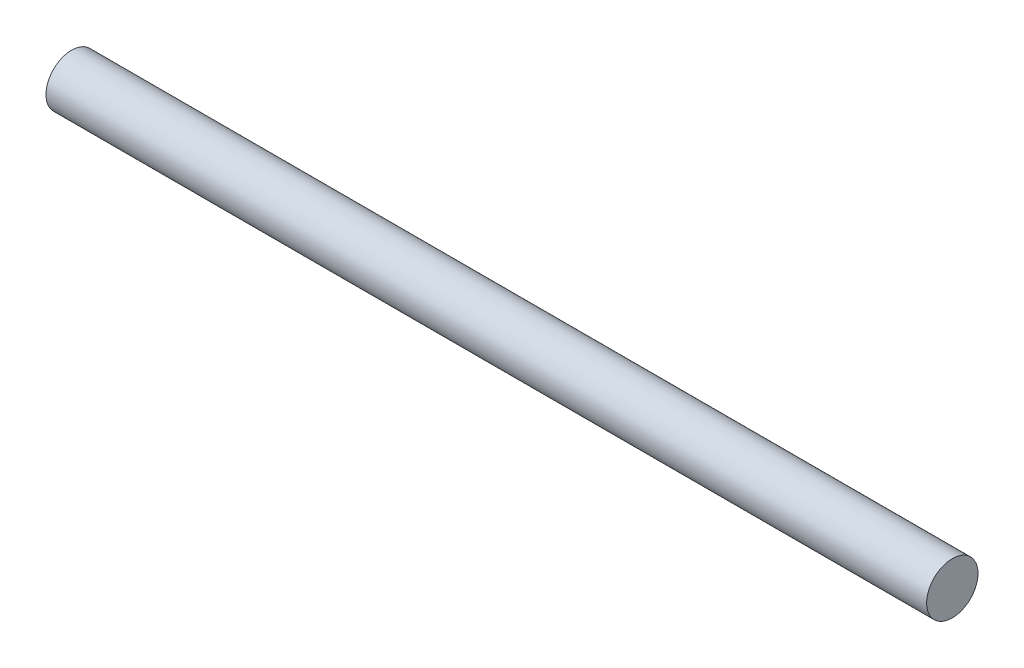
ISO-10303-21;
HEADER;
FILE_DESCRIPTION(('STEP AP214'),'2;1');
FILE_NAME('part.step','',(''),(''),'','','');
FILE_SCHEMA(('AUTOMOTIVE_DESIGN { 1 0 10303 214 1 1 1 1 }'));
ENDSEC;
DATA;
#1=APPLICATION_CONTEXT('core data for automotive mechanical design processes');
#2=APPLICATION_PROTOCOL_DEFINITION('international standard','automotive_design',2000,#1);
#3=PRODUCT_CONTEXT('',#1,'mechanical');
#4=PRODUCT('Part','Part','',(#3));
#5=PRODUCT_RELATED_PRODUCT_CATEGORY('part','',(#4));
#6=PRODUCT_DEFINITION_FORMATION('','',#4);
#7=PRODUCT_DEFINITION_CONTEXT('part definition',#1,'design');
#8=PRODUCT_DEFINITION('design','',#6,#7);
#9=PRODUCT_DEFINITION_SHAPE('','',#8);
#10=(LENGTH_UNIT() NAMED_UNIT(*) SI_UNIT(.MILLI.,.METRE.));
#11=(NAMED_UNIT(*) PLANE_ANGLE_UNIT() SI_UNIT($,.RADIAN.));
#12=(NAMED_UNIT(*) SI_UNIT($,.STERADIAN.) SOLID_ANGLE_UNIT());
#13=UNCERTAINTY_MEASURE_WITH_UNIT(LENGTH_MEASURE(1.E-05),#10,'distance_accuracy_value','');
#14=(GEOMETRIC_REPRESENTATION_CONTEXT(3) GLOBAL_UNCERTAINTY_ASSIGNED_CONTEXT((#13)) GLOBAL_UNIT_ASSIGNED_CONTEXT((#10,
#11,#12)) REPRESENTATION_CONTEXT('',''));
#15=CARTESIAN_POINT('',(0.,0.,0.));
#16=DIRECTION('',(0.,0.,1.));
#17=DIRECTION('',(1.,0.,0.));
#18=AXIS2_PLACEMENT_3D('',#15,#16,#17);
#19=CARTESIAN_POINT('',(48.,0.,0.));
#20=DIRECTION('',(-1.,0.,0.));
#21=DIRECTION('',(0.,0.,1.));
#22=AXIS2_PLACEMENT_3D('',#19,#20,#21);
#23=CYLINDRICAL_SURFACE('',#22,1.4);
#24=CARTESIAN_POINT('',(48.,0.,0.));
#25=DIRECTION('',(1.,0.,0.));
#26=DIRECTION('',(0.,0.,-1.));
#27=AXIS2_PLACEMENT_3D('',#24,#25,#26);
#28=CIRCLE('',#27,1.4);
#29=CARTESIAN_POINT('',(48.,0.,-1.4));
#30=VERTEX_POINT('',#29);
#31=EDGE_CURVE('E10',#30,#30,#28,.T.);
#32=ORIENTED_EDGE('',*,*,#31,.F.);
#33=EDGE_LOOP('',(#32));
#34=FACE_BOUND('',#33,.T.);
#35=CARTESIAN_POINT('',(0.,0.,0.));
#36=DIRECTION('',(1.,0.,0.));
#37=DIRECTION('',(0.,0.,-1.));
#38=AXIS2_PLACEMENT_3D('',#35,#36,#37);
#39=CIRCLE('',#38,1.4);
#40=CARTESIAN_POINT('',(0.,0.,-1.4));
#41=VERTEX_POINT('',#40);
#42=EDGE_CURVE('E36',#41,#41,#39,.T.);
#43=ORIENTED_EDGE('',*,*,#42,.T.);
#44=EDGE_LOOP('',(#43));
#45=FACE_BOUND('',#44,.T.);
#46=ADVANCED_FACE('F33',(#34,#45),#23,.T.);
#47=CARTESIAN_POINT('',(48.,0.,0.));
#48=DIRECTION('',(1.,0.,0.));
#49=DIRECTION('',(0.,0.,-1.));
#50=AXIS2_PLACEMENT_3D('',#47,#48,#49);
#51=PLANE('',#50);
#52=ORIENTED_EDGE('',*,*,#31,.T.);
#53=EDGE_LOOP('',(#52));
#54=FACE_BOUND('',#53,.T.);
#55=ADVANCED_FACE('F48',(#54),#51,.T.);
#56=CARTESIAN_POINT('',(0.,0.,0.));
#57=DIRECTION('',(1.,0.,0.));
#58=DIRECTION('',(0.,0.,-1.));
#59=AXIS2_PLACEMENT_3D('',#56,#57,#58);
#60=PLANE('',#59);
#61=ORIENTED_EDGE('',*,*,#42,.F.);
#62=EDGE_LOOP('',(#61));
#63=FACE_BOUND('',#62,.T.);
#64=ADVANCED_FACE('F46',(#63),#60,.F.);
#65=CLOSED_SHELL('',(#46,#55,#64));
#66=MANIFOLD_SOLID_BREP('B2',#65);
#67=ADVANCED_BREP_SHAPE_REPRESENTATION('',(#18,#66),#14);
#68=SHAPE_DEFINITION_REPRESENTATION(#9,#67);
ENDSEC;
END-ISO-10303-21;
